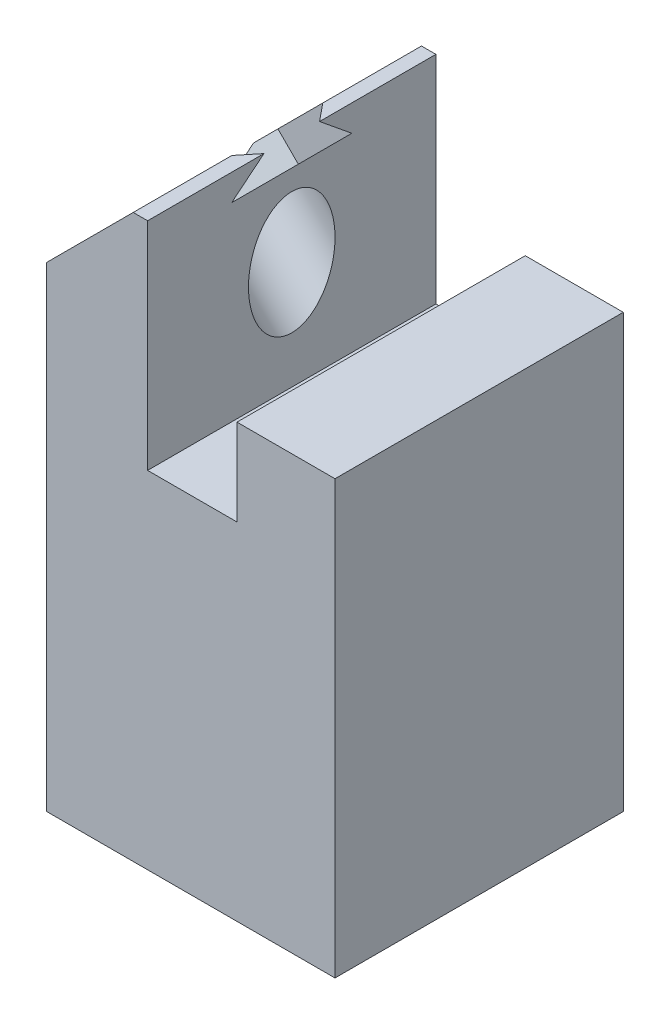
ISO-10303-21;
HEADER;
FILE_DESCRIPTION(('STEP AP214'),'2;1');
FILE_NAME('part.step','',(''),(''),'','','');
FILE_SCHEMA(('AUTOMOTIVE_DESIGN { 1 0 10303 214 1 1 1 1 }'));
ENDSEC;
DATA;
#1=APPLICATION_CONTEXT('core data for automotive mechanical design processes');
#2=APPLICATION_PROTOCOL_DEFINITION('international standard','automotive_design',2000,#1);
#3=PRODUCT_CONTEXT('',#1,'mechanical');
#4=PRODUCT('Part','Part','',(#3));
#5=PRODUCT_RELATED_PRODUCT_CATEGORY('part','',(#4));
#6=PRODUCT_DEFINITION_FORMATION('','',#4);
#7=PRODUCT_DEFINITION_CONTEXT('part definition',#1,'design');
#8=PRODUCT_DEFINITION('design','',#6,#7);
#9=PRODUCT_DEFINITION_SHAPE('','',#8);
#10=(LENGTH_UNIT() NAMED_UNIT(*) SI_UNIT(.MILLI.,.METRE.));
#11=(NAMED_UNIT(*) PLANE_ANGLE_UNIT() SI_UNIT($,.RADIAN.));
#12=(NAMED_UNIT(*) SI_UNIT($,.STERADIAN.) SOLID_ANGLE_UNIT());
#13=UNCERTAINTY_MEASURE_WITH_UNIT(LENGTH_MEASURE(1.E-05),#10,'distance_accuracy_value','');
#14=(GEOMETRIC_REPRESENTATION_CONTEXT(3) GLOBAL_UNCERTAINTY_ASSIGNED_CONTEXT((#13)) GLOBAL_UNIT_ASSIGNED_CONTEXT((#10,
#11,#12)) REPRESENTATION_CONTEXT('',''));
#15=CARTESIAN_POINT('',(0.,0.,0.));
#16=DIRECTION('',(0.,0.,1.));
#17=DIRECTION('',(1.,0.,0.));
#18=AXIS2_PLACEMENT_3D('',#15,#16,#17);
#19=CARTESIAN_POINT('',(0.,21.,0.));
#20=DIRECTION('',(0.,-1.,0.));
#21=DIRECTION('',(0.,0.,-1.));
#22=AXIS2_PLACEMENT_3D('',#19,#20,#21);
#23=PLANE('',#22);
#24=DIRECTION('',(0.,0.,-1.));
#25=VECTOR('',#24,1.);
#26=CARTESIAN_POINT('',(-3.,21.,10.));
#27=LINE('',#26,#25);
#28=CARTESIAN_POINT('',(-3.,21.,10.));
#29=VERTEX_POINT('',#28);
#30=CARTESIAN_POINT('',(-3.,21.,1.92808109443833));
#31=VERTEX_POINT('',#30);
#32=EDGE_CURVE('E334',#29,#31,#27,.T.);
#33=ORIENTED_EDGE('',*,*,#32,.T.);
#34=DIRECTION('',(-0.632455532033677,0.,0.774596669241483));
#35=VECTOR('',#34,1.);
#36=CARTESIAN_POINT('',(-0.85543702718383,21.,-0.698461407894577));
#37=LINE('',#36,#35);
#38=CARTESIAN_POINT('',(-4.00000000000001,21.,3.15282596582992));
#39=VERTEX_POINT('',#38);
#40=EDGE_CURVE('E309',#31,#39,#37,.T.);
#41=ORIENTED_EDGE('',*,*,#40,.T.);
#42=DIRECTION('',(0.,0.,1.));
#43=VECTOR('',#42,1.);
#44=CARTESIAN_POINT('',(-4.00000000000001,21.,0.));
#45=LINE('',#44,#43);
#46=CARTESIAN_POINT('',(-4.00000000000001,21.,10.));
#47=VERTEX_POINT('',#46);
#48=EDGE_CURVE('E380',#39,#47,#45,.T.);
#49=ORIENTED_EDGE('',*,*,#48,.T.);
#50=DIRECTION('',(1.,0.,0.));
#51=VECTOR('',#50,1.);
#52=CARTESIAN_POINT('',(-10.,21.,10.));
#53=LINE('',#52,#51);
#54=EDGE_CURVE('E331',#47,#29,#53,.T.);
#55=ORIENTED_EDGE('',*,*,#54,.T.);
#56=EDGE_LOOP('',(#33,#41,#49,#55));
#57=FACE_BOUND('',#56,.T.);
#58=ADVANCED_FACE('F34',(#57),#23,.F.);
#59=CARTESIAN_POINT('',(-4.00000000000001,21.,0.));
#60=DIRECTION('',(0.707106781186549,-0.707106781186546,0.));
#61=DIRECTION('',(0.,0.,1.));
#62=AXIS2_PLACEMENT_3D('',#59,#60,#61);
#63=PLANE('',#62);
#64=DIRECTION('',(0.353553390593273,0.353553390593274,-0.866025403784439));
#65=VECTOR('',#64,1.);
#66=CARTESIAN_POINT('',(-4.97864220139431,20.0213577986057,5.55));
#67=LINE('',#66,#65);
#68=CARTESIAN_POINT('',(-4.97864220139431,20.0213577986057,5.55));
#69=VERTEX_POINT('',#68);
#70=EDGE_CURVE('E254',#69,#39,#67,.T.);
#71=ORIENTED_EDGE('',*,*,#70,.F.);
#72=DIRECTION('',(0.707106781186546,0.707106781186549,0.));
#73=VECTOR('',#72,1.);
#74=CARTESIAN_POINT('',(-9.51019822554318,15.4898017744568,5.55));
#75=LINE('',#74,#73);
#76=CARTESIAN_POINT('',(-9.51019822554318,15.4898017744568,5.55));
#77=VERTEX_POINT('',#76);
#78=EDGE_CURVE('E259',#77,#69,#75,.T.);
#79=ORIENTED_EDGE('',*,*,#78,.F.);
#80=DIRECTION('',(0.353553390593273,0.353553390593274,0.866025403784439));
#81=VECTOR('',#80,1.);
#82=CARTESIAN_POINT('',(-11.7759762376176,13.2240237623824,0.));
#83=LINE('',#82,#81);
#84=CARTESIAN_POINT('',(-10.,15.,4.350235577471));
#85=VERTEX_POINT('',#84);
#86=EDGE_CURVE('E281',#85,#77,#83,.T.);
#87=ORIENTED_EDGE('',*,*,#86,.F.);
#88=DIRECTION('',(0.,0.,-1.));
#89=VECTOR('',#88,1.);
#90=CARTESIAN_POINT('',(-10.,15.,10.));
#91=LINE('',#90,#89);
#92=CARTESIAN_POINT('',(-10.,15.,10.));
#93=VERTEX_POINT('',#92);
#94=EDGE_CURVE('E43',#93,#85,#91,.T.);
#95=ORIENTED_EDGE('',*,*,#94,.F.);
#96=DIRECTION('',(0.707106781186546,0.707106781186549,0.));
#97=VECTOR('',#96,1.);
#98=CARTESIAN_POINT('',(-4.00000000000001,21.,10.));
#99=LINE('',#98,#97);
#100=EDGE_CURVE('E384',#47,#93,#99,.F.);
#101=ORIENTED_EDGE('',*,*,#100,.F.);
#102=ORIENTED_EDGE('',*,*,#48,.F.);
#103=EDGE_LOOP('',(#71,#79,#87,#95,#101,#102));
#104=FACE_BOUND('',#103,.T.);
#105=ADVANCED_FACE('F397',(#104),#63,.F.);
#106=CARTESIAN_POINT('',(-0.173352401603255,10.6845119746658,0.));
#107=DIRECTION('',(-0.707106781186549,0.707106781186546,0.));
#108=DIRECTION('',(-0.707106781186546,-0.707106781186549,0.));
#109=AXIS2_PLACEMENT_3D('',#106,#107,#108);
#110=CYLINDRICAL_SURFACE('',#109,3.);
#111=CARTESIAN_POINT('',(-3.,13.5111595730625,0.));
#112=DIRECTION('',(-1.,0.,0.));
#113=DIRECTION('',(0.,1.,0.));
#114=AXIS2_PLACEMENT_3D('',#111,#112,#113);
#115=ELLIPSE('',#114,4.24264068711928,3.);
#116=CARTESIAN_POINT('',(-3.,17.7538002601818,0.));
#117=VERTEX_POINT('',#116);
#118=EDGE_CURVE('E327',#117,#117,#115,.T.);
#119=ORIENTED_EDGE('',*,*,#118,.F.);
#120=EDGE_LOOP('',(#119));
#121=FACE_BOUND('',#120,.T.);
#122=CARTESIAN_POINT('',(-5.83020665109565,16.3413662241582,0.));
#123=DIRECTION('',(-0.707106781186549,0.707106781186546,0.));
#124=DIRECTION('',(-0.707106781186546,-0.707106781186549,0.));
#125=AXIS2_PLACEMENT_3D('',#122,#123,#124);
#126=CIRCLE('',#125,3.);
#127=CARTESIAN_POINT('',(-7.95152699465529,14.2200458805985,0.));
#128=VERTEX_POINT('',#127);
#129=EDGE_CURVE('E287',#128,#128,#126,.F.);
#130=ORIENTED_EDGE('',*,*,#129,.F.);
#131=EDGE_LOOP('',(#130));
#132=FACE_BOUND('',#131,.T.);
#133=ADVANCED_FACE('F394',(#121,#132),#110,.F.);
#134=CARTESIAN_POINT('',(0.,6.,0.));
#135=DIRECTION('',(0.,-1.,0.));
#136=DIRECTION('',(0.,0.,-1.));
#137=AXIS2_PLACEMENT_3D('',#134,#135,#136);
#138=PLANE('',#137);
#139=DIRECTION('',(0.,0.,-1.));
#140=VECTOR('',#139,1.);
#141=CARTESIAN_POINT('',(-3.,6.,10.));
#142=LINE('',#141,#140);
#143=CARTESIAN_POINT('',(-3.,6.,10.));
#144=VERTEX_POINT('',#143);
#145=CARTESIAN_POINT('',(-3.,6.,-10.));
#146=VERTEX_POINT('',#145);
#147=EDGE_CURVE('E330',#144,#146,#142,.T.);
#148=ORIENTED_EDGE('',*,*,#147,.F.);
#149=DIRECTION('',(1.,0.,0.));
#150=VECTOR('',#149,1.);
#151=CARTESIAN_POINT('',(-10.,6.,10.));
#152=LINE('',#151,#150);
#153=CARTESIAN_POINT('',(3.2,6.,10.));
#154=VERTEX_POINT('',#153);
#155=EDGE_CURVE('E370',#144,#154,#152,.T.);
#156=ORIENTED_EDGE('',*,*,#155,.T.);
#157=DIRECTION('',(0.,0.,1.));
#158=VECTOR('',#157,1.);
#159=CARTESIAN_POINT('',(3.2,6.,10.));
#160=LINE('',#159,#158);
#161=CARTESIAN_POINT('',(3.2,6.,-10.));
#162=VERTEX_POINT('',#161);
#163=EDGE_CURVE('E348',#162,#154,#160,.T.);
#164=ORIENTED_EDGE('',*,*,#163,.F.);
#165=DIRECTION('',(-1.,0.,0.));
#166=VECTOR('',#165,1.);
#167=CARTESIAN_POINT('',(-10.,6.,-10.));
#168=LINE('',#167,#166);
#169=EDGE_CURVE('E368',#162,#146,#168,.T.);
#170=ORIENTED_EDGE('',*,*,#169,.T.);
#171=EDGE_LOOP('',(#148,#156,#164,#170));
#172=FACE_BOUND('',#171,.T.);
#173=ADVANCED_FACE('F396',(#172),#138,.F.);
#174=CARTESIAN_POINT('',(10.,6.,10.));
#175=DIRECTION('',(-1.,0.,0.));
#176=DIRECTION('',(0.,0.,1.));
#177=AXIS2_PLACEMENT_3D('',#174,#175,#176);
#178=PLANE('',#177);
#179=DIRECTION('',(0.,-1.,0.));
#180=VECTOR('',#179,1.);
#181=CARTESIAN_POINT('',(10.,6.,10.));
#182=LINE('',#181,#180);
#183=CARTESIAN_POINT('',(10.,12.,10.));
#184=VERTEX_POINT('',#183);
#185=CARTESIAN_POINT('',(10.,-18.,10.));
#186=VERTEX_POINT('',#185);
#187=EDGE_CURVE('E372',#184,#186,#182,.T.);
#188=ORIENTED_EDGE('',*,*,#187,.T.);
#189=DIRECTION('',(0.,0.,1.));
#190=VECTOR('',#189,1.);
#191=CARTESIAN_POINT('',(10.,-18.,-10.));
#192=LINE('',#191,#190);
#193=CARTESIAN_POINT('',(10.,-18.,-10.));
#194=VERTEX_POINT('',#193);
#195=EDGE_CURVE('E321',#194,#186,#192,.T.);
#196=ORIENTED_EDGE('',*,*,#195,.F.);
#197=DIRECTION('',(0.,-1.,0.));
#198=VECTOR('',#197,1.);
#199=CARTESIAN_POINT('',(10.,6.,-10.));
#200=LINE('',#199,#198);
#201=CARTESIAN_POINT('',(10.,12.,-10.));
#202=VERTEX_POINT('',#201);
#203=EDGE_CURVE('E378',#202,#194,#200,.T.);
#204=ORIENTED_EDGE('',*,*,#203,.F.);
#205=DIRECTION('',(0.,0.,-1.));
#206=VECTOR('',#205,1.);
#207=CARTESIAN_POINT('',(10.,12.,10.));
#208=LINE('',#207,#206);
#209=EDGE_CURVE('E355',#184,#202,#208,.T.);
#210=ORIENTED_EDGE('',*,*,#209,.F.);
#211=EDGE_LOOP('',(#188,#196,#204,#210));
#212=FACE_BOUND('',#211,.T.);
#213=ADVANCED_FACE('F404',(#212),#178,.F.);
#214=CARTESIAN_POINT('',(-10.,6.,-10.));
#215=DIRECTION('',(0.,0.,1.));
#216=DIRECTION('',(1.,0.,0.));
#217=AXIS2_PLACEMENT_3D('',#214,#215,#216);
#218=PLANE('',#217);
#219=DIRECTION('',(0.,-1.,0.));
#220=VECTOR('',#219,1.);
#221=CARTESIAN_POINT('',(-10.,6.,-10.));
#222=LINE('',#221,#220);
#223=CARTESIAN_POINT('',(-10.,15.,-10.));
#224=VERTEX_POINT('',#223);
#225=CARTESIAN_POINT('',(-10.,-18.,-10.));
#226=VERTEX_POINT('',#225);
#227=EDGE_CURVE('E376',#224,#226,#222,.T.);
#228=ORIENTED_EDGE('',*,*,#227,.F.);
#229=DIRECTION('',(-0.707106781186546,-0.707106781186549,0.));
#230=VECTOR('',#229,1.);
#231=CARTESIAN_POINT('',(-4.00000000000001,21.,-10.));
#232=LINE('',#231,#230);
#233=CARTESIAN_POINT('',(-4.00000000000001,21.,-10.));
#234=VERTEX_POINT('',#233);
#235=EDGE_CURVE('E11',#224,#234,#232,.F.);
#236=ORIENTED_EDGE('',*,*,#235,.T.);
#237=DIRECTION('',(-1.,0.,0.));
#238=VECTOR('',#237,1.);
#239=CARTESIAN_POINT('',(-10.,21.,-10.));
#240=LINE('',#239,#238);
#241=CARTESIAN_POINT('',(-3.,21.,-10.));
#242=VERTEX_POINT('',#241);
#243=EDGE_CURVE('E337',#242,#234,#240,.T.);
#244=ORIENTED_EDGE('',*,*,#243,.F.);
#245=DIRECTION('',(0.,-1.,0.));
#246=VECTOR('',#245,1.);
#247=CARTESIAN_POINT('',(-3.,21.,-10.));
#248=LINE('',#247,#246);
#249=EDGE_CURVE('E340',#242,#146,#248,.T.);
#250=ORIENTED_EDGE('',*,*,#249,.T.);
#251=ORIENTED_EDGE('',*,*,#169,.F.);
#252=DIRECTION('',(0.,-1.,0.));
#253=VECTOR('',#252,1.);
#254=CARTESIAN_POINT('',(3.2,12.,-10.));
#255=LINE('',#254,#253);
#256=CARTESIAN_POINT('',(3.2,12.,-10.));
#257=VERTEX_POINT('',#256);
#258=EDGE_CURVE('E360',#257,#162,#255,.T.);
#259=ORIENTED_EDGE('',*,*,#258,.F.);
#260=DIRECTION('',(-1.,0.,0.));
#261=VECTOR('',#260,1.);
#262=CARTESIAN_POINT('',(3.2,12.,-10.));
#263=LINE('',#262,#261);
#264=EDGE_CURVE('E358',#202,#257,#263,.T.);
#265=ORIENTED_EDGE('',*,*,#264,.F.);
#266=ORIENTED_EDGE('',*,*,#203,.T.);
#267=DIRECTION('',(1.,0.,0.));
#268=VECTOR('',#267,1.);
#269=CARTESIAN_POINT('',(10.,-18.,-10.));
#270=LINE('',#269,#268);
#271=EDGE_CURVE('E318',#226,#194,#270,.T.);
#272=ORIENTED_EDGE('',*,*,#271,.F.);
#273=EDGE_LOOP('',(#228,#236,#244,#250,#251,#259,#265,#266,#272));
#274=FACE_BOUND('',#273,.T.);
#275=ADVANCED_FACE('F450',(#274),#218,.F.);
#276=CARTESIAN_POINT('',(-10.,6.,10.));
#277=DIRECTION('',(1.,0.,0.));
#278=DIRECTION('',(0.,0.,-1.));
#279=AXIS2_PLACEMENT_3D('',#276,#277,#278);
#280=PLANE('',#279);
#281=ORIENTED_EDGE('',*,*,#94,.T.);
#282=DIRECTION('',(0.,-0.632455532033675,-0.774596669241484));
#283=VECTOR('',#282,1.);
#284=CARTESIAN_POINT('',(-10.,14.1678080004252,3.33101269397869));
#285=LINE('',#284,#283);
#286=CARTESIAN_POINT('',(-10.,12.1715728752538,0.886133962333245));
#287=VERTEX_POINT('',#286);
#288=EDGE_CURVE('E306',#85,#287,#285,.T.);
#289=ORIENTED_EDGE('',*,*,#288,.T.);
#290=DIRECTION('',(0.,0.,1.));
#291=VECTOR('',#290,1.);
#292=CARTESIAN_POINT('',(-10.,12.1715728752538,10.));
#293=LINE('',#292,#291);
#294=CARTESIAN_POINT('',(-10.,12.1715728752538,-0.886133962333247));
#295=VERTEX_POINT('',#294);
#296=EDGE_CURVE('E297',#295,#287,#293,.T.);
#297=ORIENTED_EDGE('',*,*,#296,.F.);
#298=DIRECTION('',(0.,0.632455532033675,-0.774596669241484));
#299=VECTOR('',#298,1.);
#300=CARTESIAN_POINT('',(-10.,4.36984902929251,8.66898730602132));
#301=LINE('',#300,#299);
#302=CARTESIAN_POINT('',(-10.,15.,-4.350235577471));
#303=VERTEX_POINT('',#302);
#304=EDGE_CURVE('E303',#295,#303,#301,.T.);
#305=ORIENTED_EDGE('',*,*,#304,.T.);
#306=EDGE_CURVE('E386',#303,#224,#91,.T.);
#307=ORIENTED_EDGE('',*,*,#306,.T.);
#308=ORIENTED_EDGE('',*,*,#227,.T.);
#309=DIRECTION('',(0.,0.,-1.));
#310=VECTOR('',#309,1.);
#311=CARTESIAN_POINT('',(-10.,-18.,-10.));
#312=LINE('',#311,#310);
#313=CARTESIAN_POINT('',(-10.,-18.,10.));
#314=VERTEX_POINT('',#313);
#315=EDGE_CURVE('E315',#314,#226,#312,.T.);
#316=ORIENTED_EDGE('',*,*,#315,.F.);
#317=DIRECTION('',(0.,-1.,0.));
#318=VECTOR('',#317,1.);
#319=CARTESIAN_POINT('',(-10.,6.,10.));
#320=LINE('',#319,#318);
#321=EDGE_CURVE('E374',#93,#314,#320,.T.);
#322=ORIENTED_EDGE('',*,*,#321,.F.);
#323=EDGE_LOOP('',(#281,#289,#297,#305,#307,#308,#316,#322));
#324=FACE_BOUND('',#323,.T.);
#325=ADVANCED_FACE('F454',(#324),#280,.F.);
#326=CARTESIAN_POINT('',(-10.,6.,10.));
#327=DIRECTION('',(0.,0.,-1.));
#328=DIRECTION('',(-1.,0.,0.));
#329=AXIS2_PLACEMENT_3D('',#326,#327,#328);
#330=PLANE('',#329);
#331=ORIENTED_EDGE('',*,*,#54,.F.);
#332=ORIENTED_EDGE('',*,*,#100,.T.);
#333=ORIENTED_EDGE('',*,*,#321,.T.);
#334=DIRECTION('',(-1.,0.,0.));
#335=VECTOR('',#334,1.);
#336=CARTESIAN_POINT('',(10.,-18.,10.));
#337=LINE('',#336,#335);
#338=EDGE_CURVE('E324',#186,#314,#337,.T.);
#339=ORIENTED_EDGE('',*,*,#338,.F.);
#340=ORIENTED_EDGE('',*,*,#187,.F.);
#341=DIRECTION('',(1.,0.,0.));
#342=VECTOR('',#341,1.);
#343=CARTESIAN_POINT('',(3.2,12.,10.));
#344=LINE('',#343,#342);
#345=CARTESIAN_POINT('',(3.2,12.,10.));
#346=VERTEX_POINT('',#345);
#347=EDGE_CURVE('E352',#346,#184,#344,.T.);
#348=ORIENTED_EDGE('',*,*,#347,.F.);
#349=DIRECTION('',(0.,-1.,0.));
#350=VECTOR('',#349,1.);
#351=CARTESIAN_POINT('',(3.2,12.,10.));
#352=LINE('',#351,#350);
#353=EDGE_CURVE('E365',#346,#154,#352,.T.);
#354=ORIENTED_EDGE('',*,*,#353,.T.);
#355=ORIENTED_EDGE('',*,*,#155,.F.);
#356=DIRECTION('',(0.,-1.,0.));
#357=VECTOR('',#356,1.);
#358=CARTESIAN_POINT('',(-3.,21.,10.));
#359=LINE('',#358,#357);
#360=EDGE_CURVE('E345',#29,#144,#359,.T.);
#361=ORIENTED_EDGE('',*,*,#360,.F.);
#362=EDGE_LOOP('',(#331,#332,#333,#339,#340,#348,#354,#355,#361));
#363=FACE_BOUND('',#362,.T.);
#364=ADVANCED_FACE('F486',(#363),#330,.F.);
#365=CARTESIAN_POINT('',(3.2,12.,10.));
#366=DIRECTION('',(1.,0.,0.));
#367=DIRECTION('',(0.,0.,-1.));
#368=AXIS2_PLACEMENT_3D('',#365,#366,#367);
#369=PLANE('',#368);
#370=ORIENTED_EDGE('',*,*,#163,.T.);
#371=ORIENTED_EDGE('',*,*,#353,.F.);
#372=DIRECTION('',(0.,0.,1.));
#373=VECTOR('',#372,1.);
#374=CARTESIAN_POINT('',(3.2,12.,10.));
#375=LINE('',#374,#373);
#376=EDGE_CURVE('E349',#257,#346,#375,.T.);
#377=ORIENTED_EDGE('',*,*,#376,.F.);
#378=ORIENTED_EDGE('',*,*,#258,.T.);
#379=EDGE_LOOP('',(#370,#371,#377,#378));
#380=FACE_BOUND('',#379,.T.);
#381=ADVANCED_FACE('F505',(#380),#369,.F.);
#382=CARTESIAN_POINT('',(0.,12.,0.));
#383=DIRECTION('',(0.,-1.,0.));
#384=DIRECTION('',(0.,0.,-1.));
#385=AXIS2_PLACEMENT_3D('',#382,#383,#384);
#386=PLANE('',#385);
#387=ORIENTED_EDGE('',*,*,#376,.T.);
#388=ORIENTED_EDGE('',*,*,#347,.T.);
#389=ORIENTED_EDGE('',*,*,#209,.T.);
#390=ORIENTED_EDGE('',*,*,#264,.T.);
#391=EDGE_LOOP('',(#387,#388,#389,#390));
#392=FACE_BOUND('',#391,.T.);
#393=ADVANCED_FACE('F426',(#392),#386,.F.);
#394=CARTESIAN_POINT('',(-3.,21.,10.));
#395=DIRECTION('',(-1.,0.,0.));
#396=DIRECTION('',(0.,0.,1.));
#397=AXIS2_PLACEMENT_3D('',#394,#395,#396);
#398=PLANE('',#397);
#399=ORIENTED_EDGE('',*,*,#118,.T.);
#400=EDGE_LOOP('',(#399));
#401=FACE_BOUND('',#400,.T.);
#402=DIRECTION('',(0.,0.,-1.));
#403=VECTOR('',#402,1.);
#404=CARTESIAN_POINT('',(-3.,19.1715728752538,10.));
#405=LINE('',#404,#403);
#406=CARTESIAN_POINT('',(-3.,19.1715728752538,4.16743783818448));
#407=VERTEX_POINT('',#406);
#408=CARTESIAN_POINT('',(-3.,19.1715728752538,-4.16743783818448));
#409=VERTEX_POINT('',#408);
#410=EDGE_CURVE('E295',#407,#409,#405,.T.);
#411=ORIENTED_EDGE('',*,*,#410,.F.);
#412=DIRECTION('',(0.,0.632455532033675,-0.774596669241484));
#413=VECTOR('',#412,1.);
#414=CARTESIAN_POINT('',(-3.,17.0455834872498,6.77123243777534));
#415=LINE('',#414,#413);
#416=EDGE_CURVE('E312',#407,#31,#415,.T.);
#417=ORIENTED_EDGE('',*,*,#416,.T.);
#418=ORIENTED_EDGE('',*,*,#32,.F.);
#419=ORIENTED_EDGE('',*,*,#360,.T.);
#420=ORIENTED_EDGE('',*,*,#147,.T.);
#421=ORIENTED_EDGE('',*,*,#249,.F.);
#422=CARTESIAN_POINT('',(-3.,21.,-1.92808109443833));
#423=VERTEX_POINT('',#422);
#424=EDGE_CURVE('E333',#423,#242,#27,.T.);
#425=ORIENTED_EDGE('',*,*,#424,.F.);
#426=DIRECTION('',(0.,-0.632455532033676,-0.774596669241484));
#427=VECTOR('',#426,1.);
#428=CARTESIAN_POINT('',(-3.,26.8435424583825,5.22876756222467));
#429=LINE('',#428,#427);
#430=EDGE_CURVE('E300',#423,#409,#429,.T.);
#431=ORIENTED_EDGE('',*,*,#430,.T.);
#432=EDGE_LOOP('',(#411,#417,#418,#419,#420,#421,#425,#431));
#433=FACE_BOUND('',#432,.T.);
#434=ADVANCED_FACE('F418',(#401,#433),#398,.F.);
#435=CARTESIAN_POINT('',(-4.00000000000001,21.,-3.15282596582992));
#436=VERTEX_POINT('',#435);
#437=EDGE_CURVE('E381',#234,#436,#45,.T.);
#438=ORIENTED_EDGE('',*,*,#437,.T.);
#439=DIRECTION('',(0.632455532033677,0.,0.774596669241483));
#440=VECTOR('',#439,1.);
#441=CARTESIAN_POINT('',(-0.855437027183828,21.,0.698461407894576));
#442=LINE('',#441,#440);
#443=EDGE_CURVE('E59',#436,#423,#442,.T.);
#444=ORIENTED_EDGE('',*,*,#443,.T.);
#445=ORIENTED_EDGE('',*,*,#424,.T.);
#446=ORIENTED_EDGE('',*,*,#243,.T.);
#447=EDGE_LOOP('',(#438,#444,#445,#446));
#448=FACE_BOUND('',#447,.T.);
#449=ADVANCED_FACE('F413',(#448),#23,.F.);
#450=DIRECTION('',(-0.353553390593273,-0.353553390593274,0.866025403784439));
#451=VECTOR('',#450,1.);
#452=CARTESIAN_POINT('',(-9.51019822554318,15.4898017744568,-5.55));
#453=LINE('',#452,#451);
#454=CARTESIAN_POINT('',(-9.51019822554318,15.4898017744568,-5.55));
#455=VERTEX_POINT('',#454);
#456=EDGE_CURVE('E279',#455,#303,#453,.T.);
#457=ORIENTED_EDGE('',*,*,#456,.F.);
#458=DIRECTION('',(-0.707106781186546,-0.707106781186549,0.));
#459=VECTOR('',#458,1.);
#460=CARTESIAN_POINT('',(-4.97864220139431,20.0213577986057,-5.55));
#461=LINE('',#460,#459);
#462=CARTESIAN_POINT('',(-4.97864220139431,20.0213577986057,-5.55));
#463=VERTEX_POINT('',#462);
#464=EDGE_CURVE('E276',#463,#455,#461,.T.);
#465=ORIENTED_EDGE('',*,*,#464,.F.);
#466=DIRECTION('',(-0.353553390593273,-0.353553390593275,-0.866025403784439));
#467=VECTOR('',#466,1.);
#468=CARTESIAN_POINT('',(-2.71286418931987,22.2871358106801,0.));
#469=LINE('',#468,#467);
#470=EDGE_CURVE('E274',#436,#463,#469,.T.);
#471=ORIENTED_EDGE('',*,*,#470,.F.);
#472=ORIENTED_EDGE('',*,*,#437,.F.);
#473=ORIENTED_EDGE('',*,*,#235,.F.);
#474=ORIENTED_EDGE('',*,*,#306,.F.);
#475=EDGE_LOOP('',(#457,#465,#471,#472,#473,#474));
#476=FACE_BOUND('',#475,.T.);
#477=ADVANCED_FACE('F36',(#476),#63,.F.);
#478=CARTESIAN_POINT('',(0.,-18.,0.));
#479=DIRECTION('',(0.,-1.,0.));
#480=DIRECTION('',(0.,0.,-1.));
#481=AXIS2_PLACEMENT_3D('',#478,#479,#480);
#482=PLANE('',#481);
#483=DIRECTION('',(-0.867964050699415,0.,-0.496627029765259));
#484=VECTOR('',#483,1.);
#485=CARTESIAN_POINT('',(0.022685855192477,-18.,5.83119359010722));
#486=LINE('',#485,#484);
#487=CARTESIAN_POINT('',(0.022685855192477,-18.,5.83119359010722));
#488=VERTEX_POINT('',#487);
#489=CARTESIAN_POINT('',(-5.0386188558216,-18.,2.93524332195687));
#490=VERTEX_POINT('',#489);
#491=EDGE_CURVE('E51',#488,#490,#486,.T.);
#492=ORIENTED_EDGE('',*,*,#491,.F.);
#493=DIRECTION('',(-0.864073649332432,0.,0.503365402594708));
#494=VECTOR('',#493,1.);
#495=CARTESIAN_POINT('',(5.06130471101407,-18.,2.89595026815035));
#496=LINE('',#495,#494);
#497=CARTESIAN_POINT('',(5.06130471101407,-18.,2.89595026815035));
#498=VERTEX_POINT('',#497);
#499=EDGE_CURVE('E218',#498,#488,#496,.T.);
#500=ORIENTED_EDGE('',*,*,#499,.F.);
#501=DIRECTION('',(0.00389040136698242,0.,0.999992432359967));
#502=VECTOR('',#501,1.);
#503=CARTESIAN_POINT('',(5.03861885582159,-18.,-2.93524332195687));
#504=LINE('',#503,#502);
#505=CARTESIAN_POINT('',(5.03861885582159,-18.,-2.93524332195687));
#506=VERTEX_POINT('',#505);
#507=EDGE_CURVE('E221',#506,#498,#504,.T.);
#508=ORIENTED_EDGE('',*,*,#507,.F.);
#509=DIRECTION('',(0.867964050699415,0.,0.496627029765259));
#510=VECTOR('',#509,1.);
#511=CARTESIAN_POINT('',(-0.0226858551924798,-18.,-5.83119359010722));
#512=LINE('',#511,#510);
#513=CARTESIAN_POINT('',(-0.0226858551924798,-18.,-5.83119359010722));
#514=VERTEX_POINT('',#513);
#515=EDGE_CURVE('E237',#514,#506,#512,.T.);
#516=ORIENTED_EDGE('',*,*,#515,.F.);
#517=DIRECTION('',(0.864073649332432,0.,-0.503365402594708));
#518=VECTOR('',#517,1.);
#519=CARTESIAN_POINT('',(-5.06130471101407,-18.,-2.89595026815035));
#520=LINE('',#519,#518);
#521=CARTESIAN_POINT('',(-5.06130471101407,-18.,-2.89595026815035));
#522=VERTEX_POINT('',#521);
#523=EDGE_CURVE('E234',#522,#514,#520,.T.);
#524=ORIENTED_EDGE('',*,*,#523,.F.);
#525=DIRECTION('',(-0.00389040136698197,0.,-0.999992432359967));
#526=VECTOR('',#525,1.);
#527=CARTESIAN_POINT('',(-5.0386188558216,-18.,2.93524332195687));
#528=LINE('',#527,#526);
#529=EDGE_CURVE('E232',#490,#522,#528,.T.);
#530=ORIENTED_EDGE('',*,*,#529,.F.);
#531=EDGE_LOOP('',(#492,#500,#508,#516,#524,#530));
#532=FACE_BOUND('',#531,.T.);
#533=ORIENTED_EDGE('',*,*,#315,.T.);
#534=ORIENTED_EDGE('',*,*,#271,.T.);
#535=ORIENTED_EDGE('',*,*,#195,.T.);
#536=ORIENTED_EDGE('',*,*,#338,.T.);
#537=EDGE_LOOP('',(#533,#534,#535,#536));
#538=FACE_BOUND('',#537,.T.);
#539=ADVANCED_FACE('F424',(#532,#538),#482,.T.);
#540=CARTESIAN_POINT('',(-3.56442863902121,18.6071442362326,5.55));
#541=DIRECTION('',(0.612372435695793,0.612372435695796,0.5));
#542=DIRECTION('',(-0.707106781186549,0.707106781186546,0.));
#543=AXIS2_PLACEMENT_3D('',#540,#541,#542);
#544=PLANE('',#543);
#545=DIRECTION('',(0.353553390593273,0.353553390593274,-0.866025403784439));
#546=VECTOR('',#545,1.);
#547=CARTESIAN_POINT('',(-3.56442863902121,18.6071442362326,5.55));
#548=LINE('',#547,#546);
#549=CARTESIAN_POINT('',(-3.56442863902121,18.6071442362326,5.55));
#550=VERTEX_POINT('',#549);
#551=EDGE_CURVE('E255',#550,#407,#548,.T.);
#552=ORIENTED_EDGE('',*,*,#551,.F.);
#553=DIRECTION('',(-0.707106781186549,0.707106781186546,0.));
#554=VECTOR('',#553,1.);
#555=CARTESIAN_POINT('',(-3.56442863902121,18.6071442362326,5.55));
#556=LINE('',#555,#554);
#557=EDGE_CURVE('E285',#550,#69,#556,.T.);
#558=ORIENTED_EDGE('',*,*,#557,.T.);
#559=ORIENTED_EDGE('',*,*,#70,.T.);
#560=ORIENTED_EDGE('',*,*,#40,.F.);
#561=ORIENTED_EDGE('',*,*,#416,.F.);
#562=EDGE_LOOP('',(#552,#558,#559,#560,#561));
#563=FACE_BOUND('',#562,.T.);
#564=ADVANCED_FACE('F466',(#563),#544,.F.);
#565=CARTESIAN_POINT('',(-10.3617626752445,11.8098102000093,0.));
#566=DIRECTION('',(-0.612372435695793,-0.612372435695796,0.5));
#567=DIRECTION('',(0.707106781186549,-0.707106781186546,0.));
#568=AXIS2_PLACEMENT_3D('',#565,#566,#567);
#569=PLANE('',#568);
#570=ORIENTED_EDGE('',*,*,#86,.T.);
#571=DIRECTION('',(-0.707106781186549,0.707106781186546,0.));
#572=VECTOR('',#571,1.);
#573=CARTESIAN_POINT('',(-8.09598466317008,14.0755882120837,5.55));
#574=LINE('',#573,#572);
#575=CARTESIAN_POINT('',(-8.09598466317008,14.0755882120837,5.55));
#576=VERTEX_POINT('',#575);
#577=EDGE_CURVE('E288',#576,#77,#574,.T.);
#578=ORIENTED_EDGE('',*,*,#577,.F.);
#579=DIRECTION('',(0.353553390593273,0.353553390593274,0.866025403784439));
#580=VECTOR('',#579,1.);
#581=CARTESIAN_POINT('',(-10.3617626752445,11.8098102000093,0.));
#582=LINE('',#581,#580);
#583=EDGE_CURVE('E267',#287,#576,#582,.T.);
#584=ORIENTED_EDGE('',*,*,#583,.F.);
#585=ORIENTED_EDGE('',*,*,#288,.F.);
#586=EDGE_LOOP('',(#570,#578,#584,#585));
#587=FACE_BOUND('',#586,.T.);
#588=ADVANCED_FACE('F459',(#587),#569,.F.);
#589=CARTESIAN_POINT('',(-8.09598466317008,14.0755882120837,-5.55));
#590=DIRECTION('',(-0.612372435695793,-0.612372435695796,-0.5));
#591=DIRECTION('',(0.707106781186549,-0.707106781186546,0.));
#592=AXIS2_PLACEMENT_3D('',#589,#590,#591);
#593=PLANE('',#592);
#594=DIRECTION('',(-0.353553390593273,-0.353553390593274,0.866025403784439));
#595=VECTOR('',#594,1.);
#596=CARTESIAN_POINT('',(-8.09598466317008,14.0755882120837,-5.55));
#597=LINE('',#596,#595);
#598=CARTESIAN_POINT('',(-8.09598466317008,14.0755882120837,-5.55));
#599=VERTEX_POINT('',#598);
#600=EDGE_CURVE('E264',#599,#295,#597,.T.);
#601=ORIENTED_EDGE('',*,*,#600,.F.);
#602=DIRECTION('',(-0.707106781186549,0.707106781186546,0.));
#603=VECTOR('',#602,1.);
#604=CARTESIAN_POINT('',(-8.09598466317008,14.0755882120837,-5.55));
#605=LINE('',#604,#603);
#606=EDGE_CURVE('E291',#599,#455,#605,.T.);
#607=ORIENTED_EDGE('',*,*,#606,.T.);
#608=ORIENTED_EDGE('',*,*,#456,.T.);
#609=ORIENTED_EDGE('',*,*,#304,.F.);
#610=EDGE_LOOP('',(#601,#607,#608,#609));
#611=FACE_BOUND('',#610,.T.);
#612=ADVANCED_FACE('F457',(#611),#593,.F.);
#613=CARTESIAN_POINT('',(-1.29865062694677,20.8729222483071,0.));
#614=DIRECTION('',(0.612372435695793,0.612372435695795,-0.5));
#615=DIRECTION('',(-0.707106781186549,0.707106781186546,0.));
#616=AXIS2_PLACEMENT_3D('',#613,#614,#615);
#617=PLANE('',#616);
#618=ORIENTED_EDGE('',*,*,#443,.F.);
#619=ORIENTED_EDGE('',*,*,#470,.T.);
#620=DIRECTION('',(-0.707106781186549,0.707106781186546,0.));
#621=VECTOR('',#620,1.);
#622=CARTESIAN_POINT('',(-3.56442863902121,18.6071442362326,-5.55));
#623=LINE('',#622,#621);
#624=CARTESIAN_POINT('',(-3.56442863902121,18.6071442362326,-5.55));
#625=VERTEX_POINT('',#624);
#626=EDGE_CURVE('E272',#625,#463,#623,.T.);
#627=ORIENTED_EDGE('',*,*,#626,.F.);
#628=DIRECTION('',(-0.353553390593273,-0.353553390593275,-0.866025403784439));
#629=VECTOR('',#628,1.);
#630=CARTESIAN_POINT('',(-1.29865062694677,20.8729222483071,0.));
#631=LINE('',#630,#629);
#632=EDGE_CURVE('E258',#409,#625,#631,.T.);
#633=ORIENTED_EDGE('',*,*,#632,.F.);
#634=ORIENTED_EDGE('',*,*,#430,.F.);
#635=EDGE_LOOP('',(#618,#619,#627,#633,#634));
#636=FACE_BOUND('',#635,.T.);
#637=ADVANCED_FACE('F436',(#636),#617,.F.);
#638=CARTESIAN_POINT('',(-11.0857864376269,11.0857864376269,0.));
#639=DIRECTION('',(-0.707106781186549,0.707106781186546,0.));
#640=DIRECTION('',(-0.707106781186546,-0.707106781186549,0.));
#641=AXIS2_PLACEMENT_3D('',#638,#639,#640);
#642=PLANE('',#641);
#643=ORIENTED_EDGE('',*,*,#129,.T.);
#644=EDGE_LOOP('',(#643));
#645=FACE_BOUND('',#644,.T.);
#646=ORIENTED_EDGE('',*,*,#296,.T.);
#647=ORIENTED_EDGE('',*,*,#583,.T.);
#648=DIRECTION('',(0.707106781186546,0.707106781186549,0.));
#649=VECTOR('',#648,1.);
#650=CARTESIAN_POINT('',(-8.09598466317008,14.0755882120837,5.55));
#651=LINE('',#650,#649);
#652=EDGE_CURVE('E269',#576,#550,#651,.T.);
#653=ORIENTED_EDGE('',*,*,#652,.T.);
#654=ORIENTED_EDGE('',*,*,#551,.T.);
#655=ORIENTED_EDGE('',*,*,#410,.T.);
#656=ORIENTED_EDGE('',*,*,#632,.T.);
#657=DIRECTION('',(-0.707106781186546,-0.707106781186549,0.));
#658=VECTOR('',#657,1.);
#659=CARTESIAN_POINT('',(-3.56442863902121,18.6071442362326,-5.55));
#660=LINE('',#659,#658);
#661=EDGE_CURVE('E261',#625,#599,#660,.T.);
#662=ORIENTED_EDGE('',*,*,#661,.T.);
#663=ORIENTED_EDGE('',*,*,#600,.T.);
#664=EDGE_LOOP('',(#646,#647,#653,#654,#655,#656,#662,#663));
#665=FACE_BOUND('',#664,.T.);
#666=ADVANCED_FACE('F391',(#645,#665),#642,.T.);
#667=CARTESIAN_POINT('',(-8.09598466317008,14.0755882120837,5.55));
#668=DIRECTION('',(0.,0.,1.));
#669=DIRECTION('',(0.,-1.,0.));
#670=AXIS2_PLACEMENT_3D('',#667,#668,#669);
#671=PLANE('',#670);
#672=ORIENTED_EDGE('',*,*,#78,.T.);
#673=ORIENTED_EDGE('',*,*,#557,.F.);
#674=ORIENTED_EDGE('',*,*,#652,.F.);
#675=ORIENTED_EDGE('',*,*,#577,.T.);
#676=EDGE_LOOP('',(#672,#673,#674,#675));
#677=FACE_BOUND('',#676,.T.);
#678=ADVANCED_FACE('F472',(#677),#671,.F.);
#679=CARTESIAN_POINT('',(-3.56442863902121,18.6071442362326,-5.55));
#680=DIRECTION('',(0.,0.,-1.));
#681=DIRECTION('',(-1.,0.,0.));
#682=AXIS2_PLACEMENT_3D('',#679,#680,#681);
#683=PLANE('',#682);
#684=ORIENTED_EDGE('',*,*,#464,.T.);
#685=ORIENTED_EDGE('',*,*,#606,.F.);
#686=ORIENTED_EDGE('',*,*,#661,.F.);
#687=ORIENTED_EDGE('',*,*,#626,.T.);
#688=EDGE_LOOP('',(#684,#685,#686,#687));
#689=FACE_BOUND('',#688,.T.);
#690=ADVANCED_FACE('F440',(#689),#683,.F.);
#691=CARTESIAN_POINT('',(0.,-12.,0.));
#692=DIRECTION('',(0.,-1.,0.));
#693=DIRECTION('',(0.,0.,-1.));
#694=AXIS2_PLACEMENT_3D('',#691,#692,#693);
#695=PLANE('',#694);
#696=DIRECTION('',(-0.867964050699415,0.,-0.496627029765259));
#697=VECTOR('',#696,1.);
#698=CARTESIAN_POINT('',(0.022685855192477,-12.,5.83119359010722));
#699=LINE('',#698,#697);
#700=CARTESIAN_POINT('',(0.022685855192477,-12.,5.83119359010722));
#701=VERTEX_POINT('',#700);
#702=CARTESIAN_POINT('',(-5.0386188558216,-12.,2.93524332195687));
#703=VERTEX_POINT('',#702);
#704=EDGE_CURVE('E198',#701,#703,#699,.T.);
#705=ORIENTED_EDGE('',*,*,#704,.T.);
#706=DIRECTION('',(-0.00389040136698197,0.,-0.999992432359967));
#707=VECTOR('',#706,1.);
#708=CARTESIAN_POINT('',(-5.0386188558216,-12.,2.93524332195687));
#709=LINE('',#708,#707);
#710=CARTESIAN_POINT('',(-5.06130471101407,-12.,-2.89595026815035));
#711=VERTEX_POINT('',#710);
#712=EDGE_CURVE('E207',#703,#711,#709,.T.);
#713=ORIENTED_EDGE('',*,*,#712,.T.);
#714=DIRECTION('',(0.864073649332432,0.,-0.503365402594708));
#715=VECTOR('',#714,1.);
#716=CARTESIAN_POINT('',(-5.06130471101407,-12.,-2.89595026815035));
#717=LINE('',#716,#715);
#718=CARTESIAN_POINT('',(-0.0226858551924798,-12.,-5.83119359010722));
#719=VERTEX_POINT('',#718);
#720=EDGE_CURVE('E212',#711,#719,#717,.T.);
#721=ORIENTED_EDGE('',*,*,#720,.T.);
#722=DIRECTION('',(0.867964050699415,0.,0.496627029765259));
#723=VECTOR('',#722,1.);
#724=CARTESIAN_POINT('',(-0.0226858551924798,-12.,-5.83119359010722));
#725=LINE('',#724,#723);
#726=CARTESIAN_POINT('',(5.03861885582159,-12.,-2.93524332195687));
#727=VERTEX_POINT('',#726);
#728=EDGE_CURVE('E225',#719,#727,#725,.T.);
#729=ORIENTED_EDGE('',*,*,#728,.T.);
#730=DIRECTION('',(0.00389040136698242,0.,0.999992432359967));
#731=VECTOR('',#730,1.);
#732=CARTESIAN_POINT('',(5.03861885582159,-12.,-2.93524332195687));
#733=LINE('',#732,#731);
#734=CARTESIAN_POINT('',(5.06130471101407,-12.,2.89595026815035));
#735=VERTEX_POINT('',#734);
#736=EDGE_CURVE('E228',#727,#735,#733,.T.);
#737=ORIENTED_EDGE('',*,*,#736,.T.);
#738=DIRECTION('',(-0.864073649332432,0.,0.503365402594708));
#739=VECTOR('',#738,1.);
#740=CARTESIAN_POINT('',(5.06130471101407,-12.,2.89595026815035));
#741=LINE('',#740,#739);
#742=EDGE_CURVE('E204',#735,#701,#741,.T.);
#743=ORIENTED_EDGE('',*,*,#742,.T.);
#744=EDGE_LOOP('',(#705,#713,#721,#729,#737,#743));
#745=FACE_BOUND('',#744,.T.);
#746=CARTESIAN_POINT('',(0.,-12.,0.));
#747=DIRECTION('',(0.,-1.,0.));
#748=DIRECTION('',(0.,0.,-1.));
#749=AXIS2_PLACEMENT_3D('',#746,#747,#748);
#750=CIRCLE('',#749,2.8);
#751=CARTESIAN_POINT('',(0.,-12.,-2.8));
#752=VERTEX_POINT('',#751);
#753=EDGE_CURVE('E38',#752,#752,#750,.F.);
#754=ORIENTED_EDGE('',*,*,#753,.T.);
#755=EDGE_LOOP('',(#754));
#756=FACE_BOUND('',#755,.T.);
#757=ADVANCED_FACE('F214',(#745,#756),#695,.T.);
#758=CARTESIAN_POINT('',(0.022685855192477,-12.,5.83119359010722));
#759=DIRECTION('',(-0.496627029765259,0.,0.867964050699415));
#760=DIRECTION('',(0.867964050699415,0.,0.496627029765259));
#761=AXIS2_PLACEMENT_3D('',#758,#759,#760);
#762=PLANE('',#761);
#763=ORIENTED_EDGE('',*,*,#491,.T.);
#764=DIRECTION('',(0.,-1.,0.));
#765=VECTOR('',#764,1.);
#766=CARTESIAN_POINT('',(-5.0386188558216,-12.,2.93524332195687));
#767=LINE('',#766,#765);
#768=EDGE_CURVE('E194',#703,#490,#767,.T.);
#769=ORIENTED_EDGE('',*,*,#768,.F.);
#770=ORIENTED_EDGE('',*,*,#704,.F.);
#771=DIRECTION('',(0.,-1.,0.));
#772=VECTOR('',#771,1.);
#773=CARTESIAN_POINT('',(0.022685855192477,-12.,5.83119359010722));
#774=LINE('',#773,#772);
#775=EDGE_CURVE('E242',#701,#488,#774,.T.);
#776=ORIENTED_EDGE('',*,*,#775,.T.);
#777=EDGE_LOOP('',(#763,#769,#770,#776));
#778=FACE_BOUND('',#777,.T.);
#779=ADVANCED_FACE('F196',(#778),#762,.F.);
#780=CARTESIAN_POINT('',(5.06130471101407,-12.,2.89595026815035));
#781=DIRECTION('',(0.503365402594708,0.,0.864073649332432));
#782=DIRECTION('',(0.864073649332432,0.,-0.503365402594708));
#783=AXIS2_PLACEMENT_3D('',#780,#781,#782);
#784=PLANE('',#783);
#785=ORIENTED_EDGE('',*,*,#499,.T.);
#786=ORIENTED_EDGE('',*,*,#775,.F.);
#787=ORIENTED_EDGE('',*,*,#742,.F.);
#788=DIRECTION('',(0.,-1.,0.));
#789=VECTOR('',#788,1.);
#790=CARTESIAN_POINT('',(5.06130471101407,-12.,2.89595026815035));
#791=LINE('',#790,#789);
#792=EDGE_CURVE('E244',#735,#498,#791,.T.);
#793=ORIENTED_EDGE('',*,*,#792,.T.);
#794=EDGE_LOOP('',(#785,#786,#787,#793));
#795=FACE_BOUND('',#794,.T.);
#796=ADVANCED_FACE('F627',(#795),#784,.F.);
#797=CARTESIAN_POINT('',(5.03861885582159,-12.,-2.93524332195687));
#798=DIRECTION('',(0.999992432359967,0.,-0.00389040136698242));
#799=DIRECTION('',(-0.00389040136698242,0.,-0.999992432359967));
#800=AXIS2_PLACEMENT_3D('',#797,#798,#799);
#801=PLANE('',#800);
#802=ORIENTED_EDGE('',*,*,#507,.T.);
#803=ORIENTED_EDGE('',*,*,#792,.F.);
#804=ORIENTED_EDGE('',*,*,#736,.F.);
#805=DIRECTION('',(0.,-1.,0.));
#806=VECTOR('',#805,1.);
#807=CARTESIAN_POINT('',(5.03861885582159,-12.,-2.93524332195687));
#808=LINE('',#807,#806);
#809=EDGE_CURVE('E246',#727,#506,#808,.T.);
#810=ORIENTED_EDGE('',*,*,#809,.T.);
#811=EDGE_LOOP('',(#802,#803,#804,#810));
#812=FACE_BOUND('',#811,.T.);
#813=ADVANCED_FACE('F636',(#812),#801,.F.);
#814=CARTESIAN_POINT('',(-0.0226858551924798,-12.,-5.83119359010722));
#815=DIRECTION('',(0.496627029765259,0.,-0.867964050699415));
#816=DIRECTION('',(-0.867964050699415,0.,-0.496627029765259));
#817=AXIS2_PLACEMENT_3D('',#814,#815,#816);
#818=PLANE('',#817);
#819=ORIENTED_EDGE('',*,*,#515,.T.);
#820=ORIENTED_EDGE('',*,*,#809,.F.);
#821=ORIENTED_EDGE('',*,*,#728,.F.);
#822=DIRECTION('',(0.,-1.,0.));
#823=VECTOR('',#822,1.);
#824=CARTESIAN_POINT('',(-0.0226858551924798,-12.,-5.83119359010722));
#825=LINE('',#824,#823);
#826=EDGE_CURVE('E248',#719,#514,#825,.T.);
#827=ORIENTED_EDGE('',*,*,#826,.T.);
#828=EDGE_LOOP('',(#819,#820,#821,#827));
#829=FACE_BOUND('',#828,.T.);
#830=ADVANCED_FACE('F646',(#829),#818,.F.);
#831=CARTESIAN_POINT('',(-5.06130471101407,-12.,-2.89595026815035));
#832=DIRECTION('',(-0.503365402594708,0.,-0.864073649332432));
#833=DIRECTION('',(-0.864073649332432,0.,0.503365402594708));
#834=AXIS2_PLACEMENT_3D('',#831,#832,#833);
#835=PLANE('',#834);
#836=ORIENTED_EDGE('',*,*,#523,.T.);
#837=ORIENTED_EDGE('',*,*,#826,.F.);
#838=ORIENTED_EDGE('',*,*,#720,.F.);
#839=DIRECTION('',(0.,-1.,0.));
#840=VECTOR('',#839,1.);
#841=CARTESIAN_POINT('',(-5.06130471101407,-12.,-2.89595026815035));
#842=LINE('',#841,#840);
#843=EDGE_CURVE('E203',#711,#522,#842,.T.);
#844=ORIENTED_EDGE('',*,*,#843,.T.);
#845=EDGE_LOOP('',(#836,#837,#838,#844));
#846=FACE_BOUND('',#845,.T.);
#847=ADVANCED_FACE('F656',(#846),#835,.F.);
#848=CARTESIAN_POINT('',(-5.0386188558216,-12.,2.93524332195687));
#849=DIRECTION('',(-0.999992432359967,0.,0.00389040136698197));
#850=DIRECTION('',(0.00389040136698197,0.,0.999992432359967));
#851=AXIS2_PLACEMENT_3D('',#848,#849,#850);
#852=PLANE('',#851);
#853=ORIENTED_EDGE('',*,*,#529,.T.);
#854=ORIENTED_EDGE('',*,*,#843,.F.);
#855=ORIENTED_EDGE('',*,*,#712,.F.);
#856=ORIENTED_EDGE('',*,*,#768,.T.);
#857=EDGE_LOOP('',(#853,#854,#855,#856));
#858=FACE_BOUND('',#857,.T.);
#859=ADVANCED_FACE('F208',(#858),#852,.F.);
#860=CARTESIAN_POINT('',(0.,2.,0.));
#861=DIRECTION('',(0.,-1.,0.));
#862=DIRECTION('',(0.,0.,-1.));
#863=AXIS2_PLACEMENT_3D('',#860,#861,#862);
#864=PLANE('',#863);
#865=CARTESIAN_POINT('',(0.,2.,0.));
#866=DIRECTION('',(0.,-1.,0.));
#867=DIRECTION('',(0.,0.,-1.));
#868=AXIS2_PLACEMENT_3D('',#865,#866,#867);
#869=CIRCLE('',#868,2.8);
#870=CARTESIAN_POINT('',(0.,2.,-2.8));
#871=VERTEX_POINT('',#870);
#872=EDGE_CURVE('E251',#871,#871,#869,.T.);
#873=ORIENTED_EDGE('',*,*,#872,.T.);
#874=EDGE_LOOP('',(#873));
#875=FACE_BOUND('',#874,.T.);
#876=ADVANCED_FACE('F597',(#875),#864,.T.);
#877=CARTESIAN_POINT('',(0.,2.,0.));
#878=DIRECTION('',(0.,-1.,0.));
#879=DIRECTION('',(0.,0.,-1.));
#880=AXIS2_PLACEMENT_3D('',#877,#878,#879);
#881=CYLINDRICAL_SURFACE('',#880,2.8);
#882=ORIENTED_EDGE('',*,*,#872,.F.);
#883=EDGE_LOOP('',(#882));
#884=FACE_BOUND('',#883,.T.);
#885=ORIENTED_EDGE('',*,*,#753,.F.);
#886=EDGE_LOOP('',(#885));
#887=FACE_BOUND('',#886,.T.);
#888=ADVANCED_FACE('F600',(#884,#887),#881,.F.);
#889=CLOSED_SHELL('',(#58,#105,#133,#173,#213,#275,#325,#364,#381,#393,#434,#449,#477,#539,#564,
#588,#612,#637,#666,#678,#690,#757,#779,#796,#813,#830,#847,#859,#876,#888));
#890=MANIFOLD_SOLID_BREP('B2',#889);
#891=ADVANCED_BREP_SHAPE_REPRESENTATION('',(#18,#890),#14);
#892=SHAPE_DEFINITION_REPRESENTATION(#9,#891);
ENDSEC;
END-ISO-10303-21;
